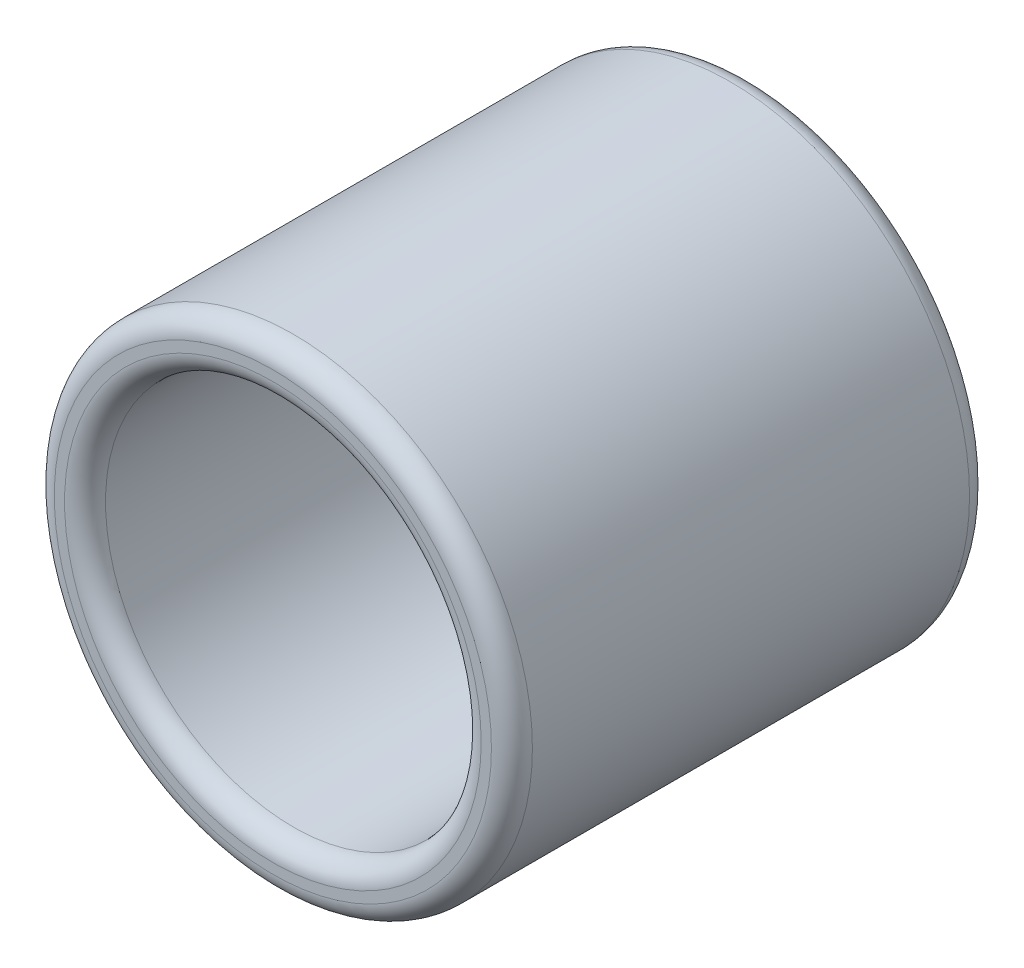
ISO-10303-21;
HEADER;
FILE_DESCRIPTION(('STEP AP214'),'2;1');
FILE_NAME('part.step','',(''),(''),'','','');
FILE_SCHEMA(('AUTOMOTIVE_DESIGN { 1 0 10303 214 1 1 1 1 }'));
ENDSEC;
DATA;
#1=APPLICATION_CONTEXT('core data for automotive mechanical design processes');
#2=APPLICATION_PROTOCOL_DEFINITION('international standard','automotive_design',2000,#1);
#3=PRODUCT_CONTEXT('',#1,'mechanical');
#4=PRODUCT('Part','Part','',(#3));
#5=PRODUCT_RELATED_PRODUCT_CATEGORY('part','',(#4));
#6=PRODUCT_DEFINITION_FORMATION('','',#4);
#7=PRODUCT_DEFINITION_CONTEXT('part definition',#1,'design');
#8=PRODUCT_DEFINITION('design','',#6,#7);
#9=PRODUCT_DEFINITION_SHAPE('','',#8);
#10=(LENGTH_UNIT() NAMED_UNIT(*) SI_UNIT(.MILLI.,.METRE.));
#11=(NAMED_UNIT(*) PLANE_ANGLE_UNIT() SI_UNIT($,.RADIAN.));
#12=(NAMED_UNIT(*) SI_UNIT($,.STERADIAN.) SOLID_ANGLE_UNIT());
#13=UNCERTAINTY_MEASURE_WITH_UNIT(LENGTH_MEASURE(1.E-05),#10,'distance_accuracy_value','');
#14=(GEOMETRIC_REPRESENTATION_CONTEXT(3) GLOBAL_UNCERTAINTY_ASSIGNED_CONTEXT((#13)) GLOBAL_UNIT_ASSIGNED_CONTEXT((#10,
#11,#12)) REPRESENTATION_CONTEXT('',''));
#15=CARTESIAN_POINT('',(0.,0.,0.));
#16=DIRECTION('',(0.,0.,1.));
#17=DIRECTION('',(1.,0.,0.));
#18=AXIS2_PLACEMENT_3D('',#15,#16,#17);
#19=CARTESIAN_POINT('',(0.,0.,7.));
#20=DIRECTION('',(0.,0.,-1.));
#21=DIRECTION('',(-1.,0.,0.));
#22=AXIS2_PLACEMENT_3D('',#19,#20,#21);
#23=CYLINDRICAL_SURFACE('',#22,3.5);
#24=CARTESIAN_POINT('',(0.,0.,6.7));
#25=DIRECTION('',(0.,0.,1.));
#26=DIRECTION('',(1.,0.,0.));
#27=AXIS2_PLACEMENT_3D('',#24,#25,#26);
#28=CIRCLE('',#27,3.5);
#29=CARTESIAN_POINT('',(3.5,0.,6.7));
#30=VERTEX_POINT('',#29);
#31=EDGE_CURVE('E10',#30,#30,#28,.F.);
#32=ORIENTED_EDGE('',*,*,#31,.T.);
#33=EDGE_LOOP('',(#32));
#34=FACE_BOUND('',#33,.T.);
#35=CARTESIAN_POINT('',(0.,0.,0.3));
#36=DIRECTION('',(0.,0.,1.));
#37=DIRECTION('',(1.,0.,0.));
#38=AXIS2_PLACEMENT_3D('',#35,#36,#37);
#39=CIRCLE('',#38,3.5);
#40=CARTESIAN_POINT('',(3.5,0.,0.3));
#41=VERTEX_POINT('',#40);
#42=EDGE_CURVE('E63',#41,#41,#39,.T.);
#43=ORIENTED_EDGE('',*,*,#42,.T.);
#44=EDGE_LOOP('',(#43));
#45=FACE_BOUND('',#44,.T.);
#46=ADVANCED_FACE('F34',(#34,#45),#23,.T.);
#47=CARTESIAN_POINT('',(0.,0.,7.));
#48=DIRECTION('',(0.,0.,1.));
#49=DIRECTION('',(1.,0.,0.));
#50=AXIS2_PLACEMENT_3D('',#47,#48,#49);
#51=PLANE('',#50);
#52=CARTESIAN_POINT('',(0.,0.,7.));
#53=DIRECTION('',(0.,0.,1.));
#54=DIRECTION('',(1.,0.,0.));
#55=AXIS2_PLACEMENT_3D('',#52,#53,#54);
#56=CIRCLE('',#55,3.2);
#57=CARTESIAN_POINT('',(3.2,0.,7.));
#58=VERTEX_POINT('',#57);
#59=EDGE_CURVE('E41',#58,#58,#56,.T.);
#60=ORIENTED_EDGE('',*,*,#59,.T.);
#61=EDGE_LOOP('',(#60));
#62=FACE_BOUND('',#61,.T.);
#63=CARTESIAN_POINT('',(0.,0.,7.));
#64=DIRECTION('',(0.,0.,1.));
#65=DIRECTION('',(1.,0.,0.));
#66=AXIS2_PLACEMENT_3D('',#63,#64,#65);
#67=CIRCLE('',#66,3.05);
#68=CARTESIAN_POINT('',(3.05,0.,7.));
#69=VERTEX_POINT('',#68);
#70=EDGE_CURVE('E54',#69,#69,#67,.F.);
#71=ORIENTED_EDGE('',*,*,#70,.T.);
#72=EDGE_LOOP('',(#71));
#73=FACE_BOUND('',#72,.T.);
#74=ADVANCED_FACE('F87',(#62,#73),#51,.T.);
#75=CARTESIAN_POINT('',(0.,0.,0.));
#76=DIRECTION('',(0.,0.,1.));
#77=DIRECTION('',(1.,0.,0.));
#78=AXIS2_PLACEMENT_3D('',#75,#76,#77);
#79=PLANE('',#78);
#80=CARTESIAN_POINT('',(0.,0.,0.));
#81=DIRECTION('',(0.,0.,1.));
#82=DIRECTION('',(1.,0.,0.));
#83=AXIS2_PLACEMENT_3D('',#80,#81,#82);
#84=CIRCLE('',#83,3.2);
#85=CARTESIAN_POINT('',(3.2,0.,0.));
#86=VERTEX_POINT('',#85);
#87=EDGE_CURVE('E57',#86,#86,#84,.F.);
#88=ORIENTED_EDGE('',*,*,#87,.T.);
#89=EDGE_LOOP('',(#88));
#90=FACE_BOUND('',#89,.T.);
#91=CARTESIAN_POINT('',(0.,0.,0.));
#92=DIRECTION('',(0.,0.,1.));
#93=DIRECTION('',(1.,0.,0.));
#94=AXIS2_PLACEMENT_3D('',#91,#92,#93);
#95=CIRCLE('',#94,3.05);
#96=CARTESIAN_POINT('',(3.05,0.,0.));
#97=VERTEX_POINT('',#96);
#98=EDGE_CURVE('E60',#97,#97,#95,.T.);
#99=ORIENTED_EDGE('',*,*,#98,.T.);
#100=EDGE_LOOP('',(#99));
#101=FACE_BOUND('',#100,.T.);
#102=ADVANCED_FACE('F81',(#90,#101),#79,.F.);
#103=CARTESIAN_POINT('',(0.,0.,7.));
#104=DIRECTION('',(0.,0.,-1.));
#105=DIRECTION('',(-1.,0.,0.));
#106=AXIS2_PLACEMENT_3D('',#103,#104,#105);
#107=CYLINDRICAL_SURFACE('',#106,2.75);
#108=CARTESIAN_POINT('',(0.,0.,6.7));
#109=DIRECTION('',(0.,0.,1.));
#110=DIRECTION('',(1.,0.,0.));
#111=AXIS2_PLACEMENT_3D('',#108,#109,#110);
#112=CIRCLE('',#111,2.75);
#113=CARTESIAN_POINT('',(2.75,0.,6.7));
#114=VERTEX_POINT('',#113);
#115=EDGE_CURVE('E45',#114,#114,#112,.T.);
#116=ORIENTED_EDGE('',*,*,#115,.T.);
#117=EDGE_LOOP('',(#116));
#118=FACE_BOUND('',#117,.T.);
#119=CARTESIAN_POINT('',(0.,0.,0.3));
#120=DIRECTION('',(0.,0.,1.));
#121=DIRECTION('',(1.,0.,0.));
#122=AXIS2_PLACEMENT_3D('',#119,#120,#121);
#123=CIRCLE('',#122,2.75);
#124=CARTESIAN_POINT('',(2.75,0.,0.3));
#125=VERTEX_POINT('',#124);
#126=EDGE_CURVE('E49',#125,#125,#123,.F.);
#127=ORIENTED_EDGE('',*,*,#126,.T.);
#128=EDGE_LOOP('',(#127));
#129=FACE_BOUND('',#128,.T.);
#130=ADVANCED_FACE('F71',(#118,#129),#107,.F.);
#131=CARTESIAN_POINT('',(0.,0.,0.3));
#132=DIRECTION('',(0.,0.,1.));
#133=DIRECTION('',(1.,0.,0.));
#134=AXIS2_PLACEMENT_3D('',#131,#132,#133);
#135=TOROIDAL_SURFACE('',#134,3.2,0.3);
#136=ORIENTED_EDGE('',*,*,#87,.F.);
#137=EDGE_LOOP('',(#136));
#138=FACE_BOUND('',#137,.T.);
#139=ORIENTED_EDGE('',*,*,#42,.F.);
#140=EDGE_LOOP('',(#139));
#141=FACE_BOUND('',#140,.T.);
#142=ADVANCED_FACE('F68',(#138,#141),#135,.T.);
#143=CARTESIAN_POINT('',(0.,0.,6.7));
#144=DIRECTION('',(0.,0.,1.));
#145=DIRECTION('',(1.,0.,0.));
#146=AXIS2_PLACEMENT_3D('',#143,#144,#145);
#147=TOROIDAL_SURFACE('',#146,3.05,0.3);
#148=ORIENTED_EDGE('',*,*,#115,.F.);
#149=EDGE_LOOP('',(#148));
#150=FACE_BOUND('',#149,.T.);
#151=ORIENTED_EDGE('',*,*,#70,.F.);
#152=EDGE_LOOP('',(#151));
#153=FACE_BOUND('',#152,.T.);
#154=ADVANCED_FACE('F70',(#150,#153),#147,.T.);
#155=CARTESIAN_POINT('',(0.,0.,0.3));
#156=DIRECTION('',(0.,0.,1.));
#157=DIRECTION('',(1.,0.,0.));
#158=AXIS2_PLACEMENT_3D('',#155,#156,#157);
#159=TOROIDAL_SURFACE('',#158,3.05,0.3);
#160=ORIENTED_EDGE('',*,*,#98,.F.);
#161=EDGE_LOOP('',(#160));
#162=FACE_BOUND('',#161,.T.);
#163=ORIENTED_EDGE('',*,*,#126,.F.);
#164=EDGE_LOOP('',(#163));
#165=FACE_BOUND('',#164,.T.);
#166=ADVANCED_FACE('F78',(#162,#165),#159,.T.);
#167=CARTESIAN_POINT('',(0.,0.,6.7));
#168=DIRECTION('',(0.,0.,1.));
#169=DIRECTION('',(1.,0.,0.));
#170=AXIS2_PLACEMENT_3D('',#167,#168,#169);
#171=TOROIDAL_SURFACE('',#170,3.2,0.3);
#172=ORIENTED_EDGE('',*,*,#31,.F.);
#173=EDGE_LOOP('',(#172));
#174=FACE_BOUND('',#173,.T.);
#175=ORIENTED_EDGE('',*,*,#59,.F.);
#176=EDGE_LOOP('',(#175));
#177=FACE_BOUND('',#176,.T.);
#178=ADVANCED_FACE('F36',(#174,#177),#171,.T.);
#179=CLOSED_SHELL('',(#46,#74,#102,#130,#142,#154,#166,#178));
#180=MANIFOLD_SOLID_BREP('B2',#179);
#181=ADVANCED_BREP_SHAPE_REPRESENTATION('',(#18,#180),#14);
#182=SHAPE_DEFINITION_REPRESENTATION(#9,#181);
ENDSEC;
END-ISO-10303-21;
